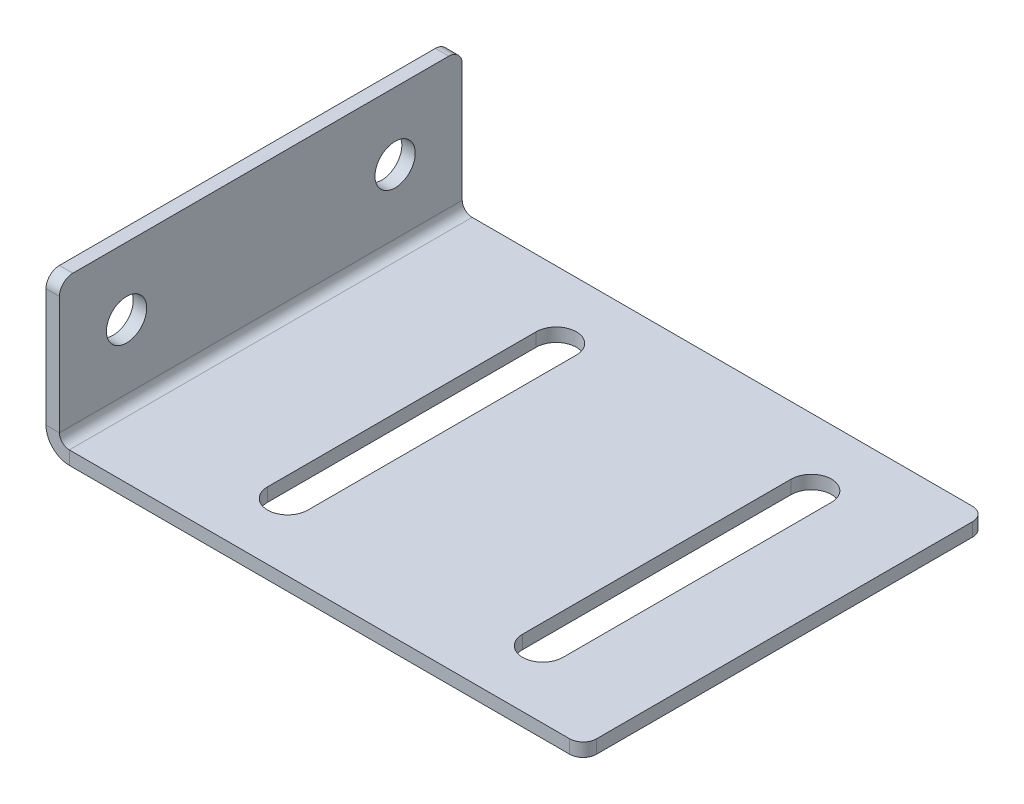
ISO-10303-21;
HEADER;
FILE_DESCRIPTION(('STEP AP214'),'2;1');
FILE_NAME('part.step','',(''),(''),'','','');
FILE_SCHEMA(('AUTOMOTIVE_DESIGN { 1 0 10303 214 1 1 1 1 }'));
ENDSEC;
DATA;
#1=APPLICATION_CONTEXT('core data for automotive mechanical design processes');
#2=APPLICATION_PROTOCOL_DEFINITION('international standard','automotive_design',2000,#1);
#3=PRODUCT_CONTEXT('',#1,'mechanical');
#4=PRODUCT('Part','Part','',(#3));
#5=PRODUCT_RELATED_PRODUCT_CATEGORY('part','',(#4));
#6=PRODUCT_DEFINITION_FORMATION('','',#4);
#7=PRODUCT_DEFINITION_CONTEXT('part definition',#1,'design');
#8=PRODUCT_DEFINITION('design','',#6,#7);
#9=PRODUCT_DEFINITION_SHAPE('','',#8);
#10=(LENGTH_UNIT() NAMED_UNIT(*) SI_UNIT(.MILLI.,.METRE.));
#11=(NAMED_UNIT(*) PLANE_ANGLE_UNIT() SI_UNIT($,.RADIAN.));
#12=(NAMED_UNIT(*) SI_UNIT($,.STERADIAN.) SOLID_ANGLE_UNIT());
#13=UNCERTAINTY_MEASURE_WITH_UNIT(LENGTH_MEASURE(1.E-05),#10,'distance_accuracy_value','');
#14=(GEOMETRIC_REPRESENTATION_CONTEXT(3) GLOBAL_UNCERTAINTY_ASSIGNED_CONTEXT((#13)) GLOBAL_UNIT_ASSIGNED_CONTEXT((#10,
#11,#12)) REPRESENTATION_CONTEXT('',''));
#15=CARTESIAN_POINT('',(0.,0.,0.));
#16=DIRECTION('',(0.,0.,1.));
#17=DIRECTION('',(1.,0.,0.));
#18=AXIS2_PLACEMENT_3D('',#15,#16,#17);
#19=CARTESIAN_POINT('',(-15.,9.53075326228543,15.));
#20=DIRECTION('',(0.,0.,1.));
#21=DIRECTION('',(0.,-1.,0.));
#22=AXIS2_PLACEMENT_3D('',#19,#20,#21);
#23=PLANE('',#22);
#24=DIRECTION('',(0.,-1.,0.));
#25=VECTOR('',#24,1.);
#26=CARTESIAN_POINT('',(-15.,9.53075326228543,15.));
#27=LINE('',#26,#25);
#28=CARTESIAN_POINT('',(-15.,9.53075326228543,15.));
#29=VERTEX_POINT('',#28);
#30=CARTESIAN_POINT('',(-15.,0.736600000000007,15.));
#31=VERTEX_POINT('',#30);
#32=EDGE_CURVE('E345',#29,#31,#27,.T.);
#33=ORIENTED_EDGE('',*,*,#32,.T.);
#34=DIRECTION('',(1.,0.,0.));
#35=VECTOR('',#34,1.);
#36=CARTESIAN_POINT('',(-15.,0.736600000000009,15.));
#37=LINE('',#36,#35);
#38=CARTESIAN_POINT('',(-14.,0.736600000000006,15.));
#39=VERTEX_POINT('',#38);
#40=EDGE_CURVE('E12',#31,#39,#37,.T.);
#41=ORIENTED_EDGE('',*,*,#40,.T.);
#42=DIRECTION('',(0.,-1.,0.));
#43=VECTOR('',#42,1.);
#44=CARTESIAN_POINT('',(-14.,9.53075326228543,15.));
#45=LINE('',#44,#43);
#46=CARTESIAN_POINT('',(-14.,9.53075326228543,15.));
#47=VERTEX_POINT('',#46);
#48=EDGE_CURVE('E55',#47,#39,#45,.T.);
#49=ORIENTED_EDGE('',*,*,#48,.F.);
#50=DIRECTION('',(1.,0.,0.));
#51=VECTOR('',#50,1.);
#52=CARTESIAN_POINT('',(-15.,9.53075326228543,15.));
#53=LINE('',#52,#51);
#54=EDGE_CURVE('E203',#29,#47,#53,.T.);
#55=ORIENTED_EDGE('',*,*,#54,.F.);
#56=EDGE_LOOP('',(#33,#41,#49,#55));
#57=FACE_BOUND('',#56,.T.);
#58=ADVANCED_FACE('F39',(#57),#23,.T.);
#59=CARTESIAN_POINT('',(-15.,9.53075326228544,-15.));
#60=DIRECTION('',(0.,0.,-1.));
#61=DIRECTION('',(0.,1.,0.));
#62=AXIS2_PLACEMENT_3D('',#59,#60,#61);
#63=PLANE('',#62);
#64=DIRECTION('',(0.,1.,0.));
#65=VECTOR('',#64,1.);
#66=CARTESIAN_POINT('',(-14.,9.53075326228543,-15.));
#67=LINE('',#66,#65);
#68=CARTESIAN_POINT('',(-14.,0.736600000000006,-15.));
#69=VERTEX_POINT('',#68);
#70=CARTESIAN_POINT('',(-14.,9.53075326228543,-15.));
#71=VERTEX_POINT('',#70);
#72=EDGE_CURVE('E62',#69,#71,#67,.T.);
#73=ORIENTED_EDGE('',*,*,#72,.F.);
#74=DIRECTION('',(-1.,0.,0.));
#75=VECTOR('',#74,1.);
#76=CARTESIAN_POINT('',(-15.,0.736600000000009,-15.));
#77=LINE('',#76,#75);
#78=CARTESIAN_POINT('',(-15.,0.736600000000002,-15.));
#79=VERTEX_POINT('',#78);
#80=EDGE_CURVE('E175',#69,#79,#77,.T.);
#81=ORIENTED_EDGE('',*,*,#80,.T.);
#82=DIRECTION('',(0.,1.,0.));
#83=VECTOR('',#82,1.);
#84=CARTESIAN_POINT('',(-15.,9.53075326228544,-15.));
#85=LINE('',#84,#83);
#86=CARTESIAN_POINT('',(-15.,9.53075326228544,-15.));
#87=VERTEX_POINT('',#86);
#88=EDGE_CURVE('E42',#79,#87,#85,.T.);
#89=ORIENTED_EDGE('',*,*,#88,.T.);
#90=DIRECTION('',(1.,0.,0.));
#91=VECTOR('',#90,1.);
#92=CARTESIAN_POINT('',(-15.,9.53075326228544,-15.));
#93=LINE('',#92,#91);
#94=EDGE_CURVE('E359',#87,#71,#93,.T.);
#95=ORIENTED_EDGE('',*,*,#94,.T.);
#96=EDGE_LOOP('',(#73,#81,#89,#95));
#97=FACE_BOUND('',#96,.T.);
#98=ADVANCED_FACE('F177',(#97),#63,.T.);
#99=CARTESIAN_POINT('',(-14.0000000000001,-38.4692467377146,14.));
#100=DIRECTION('',(1.,0.,0.));
#101=DIRECTION('',(0.,0.,1.));
#102=AXIS2_PLACEMENT_3D('',#99,#100,#101);
#103=PLANE('',#102);
#104=CARTESIAN_POINT('',(-14.,5.53075326228543,10.));
#105=DIRECTION('',(1.,0.,0.));
#106=DIRECTION('',(0.,0.,1.));
#107=AXIS2_PLACEMENT_3D('',#104,#105,#106);
#108=CIRCLE('',#107,1.5);
#109=CARTESIAN_POINT('',(-14.,5.53075326228543,11.5));
#110=VERTEX_POINT('',#109);
#111=EDGE_CURVE('E330',#110,#110,#108,.T.);
#112=ORIENTED_EDGE('',*,*,#111,.F.);
#113=EDGE_LOOP('',(#112));
#114=FACE_BOUND('',#113,.T.);
#115=CARTESIAN_POINT('',(-14.,5.53075326228543,-10.));
#116=DIRECTION('',(1.,0.,0.));
#117=DIRECTION('',(0.,0.,1.));
#118=AXIS2_PLACEMENT_3D('',#115,#116,#117);
#119=CIRCLE('',#118,1.5);
#120=CARTESIAN_POINT('',(-14.,5.53075326228543,-8.49999999999999));
#121=VERTEX_POINT('',#120);
#122=EDGE_CURVE('E224',#121,#121,#119,.T.);
#123=ORIENTED_EDGE('',*,*,#122,.F.);
#124=EDGE_LOOP('',(#123));
#125=FACE_BOUND('',#124,.T.);
#126=ORIENTED_EDGE('',*,*,#48,.T.);
#127=DIRECTION('',(0.,0.,-1.));
#128=VECTOR('',#127,1.);
#129=CARTESIAN_POINT('',(-14.,0.736600000000002,14.));
#130=LINE('',#129,#128);
#131=EDGE_CURVE('E47',#39,#69,#130,.T.);
#132=ORIENTED_EDGE('',*,*,#131,.T.);
#133=ORIENTED_EDGE('',*,*,#72,.T.);
#134=CARTESIAN_POINT('',(-14.,9.53075326228543,-14.));
#135=DIRECTION('',(1.,0.,0.));
#136=DIRECTION('',(0.,0.,1.));
#137=AXIS2_PLACEMENT_3D('',#134,#135,#136);
#138=CIRCLE('',#137,1.);
#139=CARTESIAN_POINT('',(-14.,10.5307532622854,-14.));
#140=VERTEX_POINT('',#139);
#141=EDGE_CURVE('E346',#71,#140,#138,.T.);
#142=ORIENTED_EDGE('',*,*,#141,.T.);
#143=DIRECTION('',(0.,0.,1.));
#144=VECTOR('',#143,1.);
#145=CARTESIAN_POINT('',(-14.,10.5307532622854,-14.));
#146=LINE('',#145,#144);
#147=CARTESIAN_POINT('',(-14.,10.5307532622854,14.));
#148=VERTEX_POINT('',#147);
#149=EDGE_CURVE('E349',#140,#148,#146,.T.);
#150=ORIENTED_EDGE('',*,*,#149,.T.);
#151=CARTESIAN_POINT('',(-14.,9.53075326228543,14.));
#152=DIRECTION('',(1.,0.,0.));
#153=DIRECTION('',(0.,0.,1.));
#154=AXIS2_PLACEMENT_3D('',#151,#152,#153);
#155=CIRCLE('',#154,0.999999999999999);
#156=EDGE_CURVE('E352',#148,#47,#155,.T.);
#157=ORIENTED_EDGE('',*,*,#156,.T.);
#158=EDGE_LOOP('',(#126,#132,#133,#142,#150,#157));
#159=FACE_BOUND('',#158,.T.);
#160=ADVANCED_FACE('F363',(#114,#125,#159),#103,.T.);
#161=CARTESIAN_POINT('',(-15.,9.53075326228543,14.));
#162=DIRECTION('',(1.,0.,0.));
#163=DIRECTION('',(0.,0.,1.));
#164=AXIS2_PLACEMENT_3D('',#161,#162,#163);
#165=CYLINDRICAL_SURFACE('',#164,0.999999999999999);
#166=ORIENTED_EDGE('',*,*,#156,.F.);
#167=DIRECTION('',(1.,0.,0.));
#168=VECTOR('',#167,1.);
#169=CARTESIAN_POINT('',(-15.,10.5307532622854,14.));
#170=LINE('',#169,#168);
#171=CARTESIAN_POINT('',(-15.,10.5307532622854,14.));
#172=VERTEX_POINT('',#171);
#173=EDGE_CURVE('E355',#172,#148,#170,.T.);
#174=ORIENTED_EDGE('',*,*,#173,.F.);
#175=CARTESIAN_POINT('',(-15.,9.53075326228543,14.));
#176=DIRECTION('',(1.,0.,0.));
#177=DIRECTION('',(0.,0.,1.));
#178=AXIS2_PLACEMENT_3D('',#175,#176,#177);
#179=CIRCLE('',#178,0.999999999999999);
#180=EDGE_CURVE('E342',#172,#29,#179,.T.);
#181=ORIENTED_EDGE('',*,*,#180,.T.);
#182=ORIENTED_EDGE('',*,*,#54,.T.);
#183=EDGE_LOOP('',(#166,#174,#181,#182));
#184=FACE_BOUND('',#183,.T.);
#185=ADVANCED_FACE('F425',(#184),#165,.T.);
#186=CARTESIAN_POINT('',(-15.,10.5307532622854,-14.));
#187=DIRECTION('',(0.,1.,0.));
#188=DIRECTION('',(0.,0.,1.));
#189=AXIS2_PLACEMENT_3D('',#186,#187,#188);
#190=PLANE('',#189);
#191=ORIENTED_EDGE('',*,*,#149,.F.);
#192=DIRECTION('',(1.,0.,0.));
#193=VECTOR('',#192,1.);
#194=CARTESIAN_POINT('',(-15.,10.5307532622854,-14.));
#195=LINE('',#194,#193);
#196=CARTESIAN_POINT('',(-15.,10.5307532622854,-14.));
#197=VERTEX_POINT('',#196);
#198=EDGE_CURVE('E357',#197,#140,#195,.T.);
#199=ORIENTED_EDGE('',*,*,#198,.F.);
#200=DIRECTION('',(0.,0.,1.));
#201=VECTOR('',#200,1.);
#202=CARTESIAN_POINT('',(-15.,10.5307532622854,-14.));
#203=LINE('',#202,#201);
#204=EDGE_CURVE('E339',#197,#172,#203,.T.);
#205=ORIENTED_EDGE('',*,*,#204,.T.);
#206=ORIENTED_EDGE('',*,*,#173,.T.);
#207=EDGE_LOOP('',(#191,#199,#205,#206));
#208=FACE_BOUND('',#207,.T.);
#209=ADVANCED_FACE('F370',(#208),#190,.T.);
#210=CARTESIAN_POINT('',(-15.,9.53075326228544,-14.));
#211=DIRECTION('',(1.,0.,0.));
#212=DIRECTION('',(0.,0.,1.));
#213=AXIS2_PLACEMENT_3D('',#210,#211,#212);
#214=CYLINDRICAL_SURFACE('',#213,1.);
#215=ORIENTED_EDGE('',*,*,#141,.F.);
#216=ORIENTED_EDGE('',*,*,#94,.F.);
#217=CARTESIAN_POINT('',(-15.,9.53075326228544,-14.));
#218=DIRECTION('',(1.,0.,0.));
#219=DIRECTION('',(0.,0.,1.));
#220=AXIS2_PLACEMENT_3D('',#217,#218,#219);
#221=CIRCLE('',#220,1.);
#222=EDGE_CURVE('E194',#87,#197,#221,.T.);
#223=ORIENTED_EDGE('',*,*,#222,.T.);
#224=ORIENTED_EDGE('',*,*,#198,.T.);
#225=EDGE_LOOP('',(#215,#216,#223,#224));
#226=FACE_BOUND('',#225,.T.);
#227=ADVANCED_FACE('F367',(#226),#214,.T.);
#228=CARTESIAN_POINT('',(-15.0000000000001,-38.4692467377146,14.));
#229=DIRECTION('',(1.,0.,0.));
#230=DIRECTION('',(0.,0.,1.));
#231=AXIS2_PLACEMENT_3D('',#228,#229,#230);
#232=PLANE('',#231);
#233=DIRECTION('',(0.,0.,-1.));
#234=VECTOR('',#233,1.);
#235=CARTESIAN_POINT('',(-15.,0.736600000000006,14.));
#236=LINE('',#235,#234);
#237=EDGE_CURVE('E183',#31,#79,#236,.T.);
#238=ORIENTED_EDGE('',*,*,#237,.F.);
#239=ORIENTED_EDGE('',*,*,#32,.F.);
#240=ORIENTED_EDGE('',*,*,#180,.F.);
#241=ORIENTED_EDGE('',*,*,#204,.F.);
#242=ORIENTED_EDGE('',*,*,#222,.F.);
#243=ORIENTED_EDGE('',*,*,#88,.F.);
#244=EDGE_LOOP('',(#238,#239,#240,#241,#242,#243));
#245=FACE_BOUND('',#244,.T.);
#246=CARTESIAN_POINT('',(-15.,5.53075326228543,-10.));
#247=DIRECTION('',(1.,0.,0.));
#248=DIRECTION('',(0.,0.,1.));
#249=AXIS2_PLACEMENT_3D('',#246,#247,#248);
#250=CIRCLE('',#249,1.5);
#251=CARTESIAN_POINT('',(-15.,5.53075326228543,-8.49999999999999));
#252=VERTEX_POINT('',#251);
#253=EDGE_CURVE('E327',#252,#252,#250,.T.);
#254=ORIENTED_EDGE('',*,*,#253,.T.);
#255=EDGE_LOOP('',(#254));
#256=FACE_BOUND('',#255,.T.);
#257=CARTESIAN_POINT('',(-15.,5.53075326228543,10.));
#258=DIRECTION('',(1.,0.,0.));
#259=DIRECTION('',(0.,0.,1.));
#260=AXIS2_PLACEMENT_3D('',#257,#258,#259);
#261=CIRCLE('',#260,1.5);
#262=CARTESIAN_POINT('',(-15.,5.53075326228543,11.5));
#263=VERTEX_POINT('',#262);
#264=EDGE_CURVE('E333',#263,#263,#261,.T.);
#265=ORIENTED_EDGE('',*,*,#264,.T.);
#266=EDGE_LOOP('',(#265));
#267=FACE_BOUND('',#266,.T.);
#268=ADVANCED_FACE('F188',(#245,#256,#267),#232,.F.);
#269=CARTESIAN_POINT('',(-15.,5.53075326228543,10.));
#270=DIRECTION('',(1.,0.,0.));
#271=DIRECTION('',(0.,0.,1.));
#272=AXIS2_PLACEMENT_3D('',#269,#270,#271);
#273=CYLINDRICAL_SURFACE('',#272,1.5);
#274=ORIENTED_EDGE('',*,*,#264,.F.);
#275=EDGE_LOOP('',(#274));
#276=FACE_BOUND('',#275,.T.);
#277=ORIENTED_EDGE('',*,*,#111,.T.);
#278=EDGE_LOOP('',(#277));
#279=FACE_BOUND('',#278,.T.);
#280=ADVANCED_FACE('F430',(#276,#279),#273,.F.);
#281=CARTESIAN_POINT('',(-15.,5.53075326228543,-10.));
#282=DIRECTION('',(1.,0.,0.));
#283=DIRECTION('',(0.,0.,1.));
#284=AXIS2_PLACEMENT_3D('',#281,#282,#283);
#285=CYLINDRICAL_SURFACE('',#284,1.5);
#286=ORIENTED_EDGE('',*,*,#253,.F.);
#287=EDGE_LOOP('',(#286));
#288=FACE_BOUND('',#287,.T.);
#289=ORIENTED_EDGE('',*,*,#122,.T.);
#290=EDGE_LOOP('',(#289));
#291=FACE_BOUND('',#290,.T.);
#292=ADVANCED_FACE('F439',(#288,#291),#285,.F.);
#293=CARTESIAN_POINT('',(24.,-1.,14.));
#294=DIRECTION('',(0.,1.,0.));
#295=DIRECTION('',(0.,0.,1.));
#296=AXIS2_PLACEMENT_3D('',#293,#294,#295);
#297=CYLINDRICAL_SURFACE('',#296,1.);
#298=CARTESIAN_POINT('',(24.,0.,14.));
#299=DIRECTION('',(0.,1.,0.));
#300=DIRECTION('',(0.,0.,1.));
#301=AXIS2_PLACEMENT_3D('',#298,#299,#300);
#302=CIRCLE('',#301,1.);
#303=CARTESIAN_POINT('',(24.,0.,15.));
#304=VERTEX_POINT('',#303);
#305=CARTESIAN_POINT('',(25.,0.,14.));
#306=VERTEX_POINT('',#305);
#307=EDGE_CURVE('E235',#304,#306,#302,.T.);
#308=ORIENTED_EDGE('',*,*,#307,.F.);
#309=DIRECTION('',(0.,1.,0.));
#310=VECTOR('',#309,1.);
#311=CARTESIAN_POINT('',(24.,-1.,15.));
#312=LINE('',#311,#310);
#313=CARTESIAN_POINT('',(24.,-1.,15.));
#314=VERTEX_POINT('',#313);
#315=EDGE_CURVE('E221',#314,#304,#312,.T.);
#316=ORIENTED_EDGE('',*,*,#315,.F.);
#317=CARTESIAN_POINT('',(24.,-1.,14.));
#318=DIRECTION('',(0.,1.,0.));
#319=DIRECTION('',(0.,0.,1.));
#320=AXIS2_PLACEMENT_3D('',#317,#318,#319);
#321=CIRCLE('',#320,1.);
#322=CARTESIAN_POINT('',(25.,-1.,14.));
#323=VERTEX_POINT('',#322);
#324=EDGE_CURVE('E321',#314,#323,#321,.T.);
#325=ORIENTED_EDGE('',*,*,#324,.T.);
#326=DIRECTION('',(0.,1.,0.));
#327=VECTOR('',#326,1.);
#328=CARTESIAN_POINT('',(25.,-1.,14.));
#329=LINE('',#328,#327);
#330=EDGE_CURVE('E319',#323,#306,#329,.T.);
#331=ORIENTED_EDGE('',*,*,#330,.T.);
#332=EDGE_LOOP('',(#308,#316,#325,#331));
#333=FACE_BOUND('',#332,.T.);
#334=ADVANCED_FACE('F400',(#333),#297,.T.);
#335=CARTESIAN_POINT('',(25.,-1.,-14.));
#336=DIRECTION('',(1.,0.,0.));
#337=DIRECTION('',(0.,0.,-1.));
#338=AXIS2_PLACEMENT_3D('',#335,#336,#337);
#339=PLANE('',#338);
#340=DIRECTION('',(0.,0.,-1.));
#341=VECTOR('',#340,1.);
#342=CARTESIAN_POINT('',(25.,0.,-14.));
#343=LINE('',#342,#341);
#344=CARTESIAN_POINT('',(25.,0.,-14.));
#345=VERTEX_POINT('',#344);
#346=EDGE_CURVE('E232',#306,#345,#343,.T.);
#347=ORIENTED_EDGE('',*,*,#346,.F.);
#348=ORIENTED_EDGE('',*,*,#330,.F.);
#349=DIRECTION('',(0.,0.,-1.));
#350=VECTOR('',#349,1.);
#351=CARTESIAN_POINT('',(25.,-1.,-14.));
#352=LINE('',#351,#350);
#353=CARTESIAN_POINT('',(25.,-1.,-14.));
#354=VERTEX_POINT('',#353);
#355=EDGE_CURVE('E316',#323,#354,#352,.T.);
#356=ORIENTED_EDGE('',*,*,#355,.T.);
#357=DIRECTION('',(0.,1.,0.));
#358=VECTOR('',#357,1.);
#359=CARTESIAN_POINT('',(25.,-1.,-14.));
#360=LINE('',#359,#358);
#361=EDGE_CURVE('E314',#354,#345,#360,.T.);
#362=ORIENTED_EDGE('',*,*,#361,.T.);
#363=EDGE_LOOP('',(#347,#348,#356,#362));
#364=FACE_BOUND('',#363,.T.);
#365=ADVANCED_FACE('F403',(#364),#339,.T.);
#366=CARTESIAN_POINT('',(24.,-1.,-14.));
#367=DIRECTION('',(0.,1.,0.));
#368=DIRECTION('',(0.,0.,1.));
#369=AXIS2_PLACEMENT_3D('',#366,#367,#368);
#370=CYLINDRICAL_SURFACE('',#369,1.);
#371=CARTESIAN_POINT('',(24.,0.,-14.));
#372=DIRECTION('',(0.,1.,0.));
#373=DIRECTION('',(0.,0.,-1.));
#374=AXIS2_PLACEMENT_3D('',#371,#372,#373);
#375=CIRCLE('',#374,1.);
#376=CARTESIAN_POINT('',(24.,0.,-15.));
#377=VERTEX_POINT('',#376);
#378=EDGE_CURVE('E229',#345,#377,#375,.T.);
#379=ORIENTED_EDGE('',*,*,#378,.F.);
#380=ORIENTED_EDGE('',*,*,#361,.F.);
#381=CARTESIAN_POINT('',(24.,-1.,-14.));
#382=DIRECTION('',(0.,1.,0.));
#383=DIRECTION('',(0.,0.,-1.));
#384=AXIS2_PLACEMENT_3D('',#381,#382,#383);
#385=CIRCLE('',#384,1.);
#386=CARTESIAN_POINT('',(24.,-1.,-15.));
#387=VERTEX_POINT('',#386);
#388=EDGE_CURVE('E311',#354,#387,#385,.T.);
#389=ORIENTED_EDGE('',*,*,#388,.T.);
#390=DIRECTION('',(0.,1.,0.));
#391=VECTOR('',#390,1.);
#392=CARTESIAN_POINT('',(24.,-1.,-15.));
#393=LINE('',#392,#391);
#394=EDGE_CURVE('E309',#387,#377,#393,.T.);
#395=ORIENTED_EDGE('',*,*,#394,.T.);
#396=EDGE_LOOP('',(#379,#380,#389,#395));
#397=FACE_BOUND('',#396,.T.);
#398=ADVANCED_FACE('F405',(#397),#370,.T.);
#399=CARTESIAN_POINT('',(17.,-1.,-9.99999999999999));
#400=DIRECTION('',(0.,1.,0.));
#401=DIRECTION('',(0.,0.,1.));
#402=AXIS2_PLACEMENT_3D('',#399,#400,#401);
#403=CYLINDRICAL_SURFACE('',#402,1.5);
#404=CARTESIAN_POINT('',(17.,0.,-9.99999999999999));
#405=DIRECTION('',(0.,1.,0.));
#406=DIRECTION('',(0.,0.,1.));
#407=AXIS2_PLACEMENT_3D('',#404,#405,#406);
#408=CIRCLE('',#407,1.5);
#409=CARTESIAN_POINT('',(18.5,0.,-9.99999999999999));
#410=VERTEX_POINT('',#409);
#411=CARTESIAN_POINT('',(15.5,0.,-9.99999999999999));
#412=VERTEX_POINT('',#411);
#413=EDGE_CURVE('E306',#410,#412,#408,.T.);
#414=ORIENTED_EDGE('',*,*,#413,.T.);
#415=DIRECTION('',(0.,1.,0.));
#416=VECTOR('',#415,1.);
#417=CARTESIAN_POINT('',(15.5,-1.,-9.99999999999999));
#418=LINE('',#417,#416);
#419=CARTESIAN_POINT('',(15.5,-1.,-9.99999999999999));
#420=VERTEX_POINT('',#419);
#421=EDGE_CURVE('E289',#420,#412,#418,.T.);
#422=ORIENTED_EDGE('',*,*,#421,.F.);
#423=CARTESIAN_POINT('',(17.,-1.,-9.99999999999999));
#424=DIRECTION('',(0.,1.,0.));
#425=DIRECTION('',(0.,0.,1.));
#426=AXIS2_PLACEMENT_3D('',#423,#424,#425);
#427=CIRCLE('',#426,1.5);
#428=CARTESIAN_POINT('',(18.5,-1.,-9.99999999999999));
#429=VERTEX_POINT('',#428);
#430=EDGE_CURVE('E245',#429,#420,#427,.T.);
#431=ORIENTED_EDGE('',*,*,#430,.F.);
#432=DIRECTION('',(0.,1.,0.));
#433=VECTOR('',#432,1.);
#434=CARTESIAN_POINT('',(18.5,-1.,-9.99999999999999));
#435=LINE('',#434,#433);
#436=EDGE_CURVE('E304',#429,#410,#435,.T.);
#437=ORIENTED_EDGE('',*,*,#436,.T.);
#438=EDGE_LOOP('',(#414,#422,#431,#437));
#439=FACE_BOUND('',#438,.T.);
#440=ADVANCED_FACE('F407',(#439),#403,.F.);
#441=CARTESIAN_POINT('',(18.5,-1.,10.));
#442=DIRECTION('',(1.,0.,0.));
#443=DIRECTION('',(0.,0.,-1.));
#444=AXIS2_PLACEMENT_3D('',#441,#442,#443);
#445=PLANE('',#444);
#446=DIRECTION('',(0.,0.,-1.));
#447=VECTOR('',#446,1.);
#448=CARTESIAN_POINT('',(18.5,0.,10.));
#449=LINE('',#448,#447);
#450=CARTESIAN_POINT('',(18.5,0.,10.));
#451=VERTEX_POINT('',#450);
#452=EDGE_CURVE('E301',#451,#410,#449,.T.);
#453=ORIENTED_EDGE('',*,*,#452,.T.);
#454=ORIENTED_EDGE('',*,*,#436,.F.);
#455=DIRECTION('',(0.,0.,-1.));
#456=VECTOR('',#455,1.);
#457=CARTESIAN_POINT('',(18.5,-1.,10.));
#458=LINE('',#457,#456);
#459=CARTESIAN_POINT('',(18.5,-1.,10.));
#460=VERTEX_POINT('',#459);
#461=EDGE_CURVE('E248',#460,#429,#458,.T.);
#462=ORIENTED_EDGE('',*,*,#461,.F.);
#463=DIRECTION('',(0.,1.,0.));
#464=VECTOR('',#463,1.);
#465=CARTESIAN_POINT('',(18.5,-1.,10.));
#466=LINE('',#465,#464);
#467=EDGE_CURVE('E298',#460,#451,#466,.T.);
#468=ORIENTED_EDGE('',*,*,#467,.T.);
#469=EDGE_LOOP('',(#453,#454,#462,#468));
#470=FACE_BOUND('',#469,.T.);
#471=ADVANCED_FACE('F413',(#470),#445,.F.);
#472=CARTESIAN_POINT('',(17.,-1.,10.));
#473=DIRECTION('',(0.,1.,0.));
#474=DIRECTION('',(0.,0.,1.));
#475=AXIS2_PLACEMENT_3D('',#472,#473,#474);
#476=CYLINDRICAL_SURFACE('',#475,1.5);
#477=CARTESIAN_POINT('',(17.,0.,10.));
#478=DIRECTION('',(0.,1.,0.));
#479=DIRECTION('',(0.,0.,1.));
#480=AXIS2_PLACEMENT_3D('',#477,#478,#479);
#481=CIRCLE('',#480,1.5);
#482=CARTESIAN_POINT('',(15.5,0.,10.));
#483=VERTEX_POINT('',#482);
#484=EDGE_CURVE('E296',#483,#451,#481,.T.);
#485=ORIENTED_EDGE('',*,*,#484,.T.);
#486=ORIENTED_EDGE('',*,*,#467,.F.);
#487=CARTESIAN_POINT('',(17.,-1.,10.));
#488=DIRECTION('',(0.,1.,0.));
#489=DIRECTION('',(0.,0.,1.));
#490=AXIS2_PLACEMENT_3D('',#487,#488,#489);
#491=CIRCLE('',#490,1.5);
#492=CARTESIAN_POINT('',(15.5,-1.,10.));
#493=VERTEX_POINT('',#492);
#494=EDGE_CURVE('E251',#493,#460,#491,.T.);
#495=ORIENTED_EDGE('',*,*,#494,.F.);
#496=DIRECTION('',(0.,1.,0.));
#497=VECTOR('',#496,1.);
#498=CARTESIAN_POINT('',(15.5,-1.,10.));
#499=LINE('',#498,#497);
#500=EDGE_CURVE('E294',#493,#483,#499,.T.);
#501=ORIENTED_EDGE('',*,*,#500,.T.);
#502=EDGE_LOOP('',(#485,#486,#495,#501));
#503=FACE_BOUND('',#502,.T.);
#504=ADVANCED_FACE('F472',(#503),#476,.F.);
#505=CARTESIAN_POINT('',(15.5,-1.,10.));
#506=DIRECTION('',(-1.,0.,0.));
#507=DIRECTION('',(0.,0.,1.));
#508=AXIS2_PLACEMENT_3D('',#505,#506,#507);
#509=PLANE('',#508);
#510=DIRECTION('',(0.,0.,1.));
#511=VECTOR('',#510,1.);
#512=CARTESIAN_POINT('',(15.5,0.,10.));
#513=LINE('',#512,#511);
#514=EDGE_CURVE('E291',#412,#483,#513,.T.);
#515=ORIENTED_EDGE('',*,*,#514,.T.);
#516=ORIENTED_EDGE('',*,*,#500,.F.);
#517=DIRECTION('',(0.,0.,1.));
#518=VECTOR('',#517,1.);
#519=CARTESIAN_POINT('',(15.5,-1.,10.));
#520=LINE('',#519,#518);
#521=EDGE_CURVE('E254',#420,#493,#520,.T.);
#522=ORIENTED_EDGE('',*,*,#521,.F.);
#523=ORIENTED_EDGE('',*,*,#421,.T.);
#524=EDGE_LOOP('',(#515,#516,#522,#523));
#525=FACE_BOUND('',#524,.T.);
#526=ADVANCED_FACE('F468',(#525),#509,.F.);
#527=CARTESIAN_POINT('',(-1.99999999999999,-1.,-9.99999999999999));
#528=DIRECTION('',(0.,1.,0.));
#529=DIRECTION('',(0.,0.,1.));
#530=AXIS2_PLACEMENT_3D('',#527,#528,#529);
#531=CYLINDRICAL_SURFACE('',#530,1.5);
#532=CARTESIAN_POINT('',(-1.99999999999999,0.,-9.99999999999999));
#533=DIRECTION('',(0.,1.,0.));
#534=DIRECTION('',(0.,0.,1.));
#535=AXIS2_PLACEMENT_3D('',#532,#533,#534);
#536=CIRCLE('',#535,1.5);
#537=CARTESIAN_POINT('',(-0.499999999999988,0.,-9.99999999999999));
#538=VERTEX_POINT('',#537);
#539=CARTESIAN_POINT('',(-3.49999999999999,0.,-9.99999999999999));
#540=VERTEX_POINT('',#539);
#541=EDGE_CURVE('E286',#538,#540,#536,.T.);
#542=ORIENTED_EDGE('',*,*,#541,.T.);
#543=DIRECTION('',(0.,1.,0.));
#544=VECTOR('',#543,1.);
#545=CARTESIAN_POINT('',(-3.49999999999999,-1.,-9.99999999999999));
#546=LINE('',#545,#544);
#547=CARTESIAN_POINT('',(-3.49999999999999,-1.,-9.99999999999999));
#548=VERTEX_POINT('',#547);
#549=EDGE_CURVE('E269',#548,#540,#546,.T.);
#550=ORIENTED_EDGE('',*,*,#549,.F.);
#551=CARTESIAN_POINT('',(-1.99999999999999,-1.,-9.99999999999999));
#552=DIRECTION('',(0.,1.,0.));
#553=DIRECTION('',(0.,0.,1.));
#554=AXIS2_PLACEMENT_3D('',#551,#552,#553);
#555=CIRCLE('',#554,1.5);
#556=CARTESIAN_POINT('',(-0.499999999999987,-1.,-9.99999999999999));
#557=VERTEX_POINT('',#556);
#558=EDGE_CURVE('E257',#557,#548,#555,.T.);
#559=ORIENTED_EDGE('',*,*,#558,.F.);
#560=DIRECTION('',(0.,1.,0.));
#561=VECTOR('',#560,1.);
#562=CARTESIAN_POINT('',(-0.499999999999988,-1.,-9.99999999999999));
#563=LINE('',#562,#561);
#564=EDGE_CURVE('E284',#557,#538,#563,.T.);
#565=ORIENTED_EDGE('',*,*,#564,.T.);
#566=EDGE_LOOP('',(#542,#550,#559,#565));
#567=FACE_BOUND('',#566,.T.);
#568=ADVANCED_FACE('F464',(#567),#531,.F.);
#569=CARTESIAN_POINT('',(-0.499999999999988,-1.,10.));
#570=DIRECTION('',(1.,0.,0.));
#571=DIRECTION('',(0.,0.,-1.));
#572=AXIS2_PLACEMENT_3D('',#569,#570,#571);
#573=PLANE('',#572);
#574=DIRECTION('',(0.,0.,-1.));
#575=VECTOR('',#574,1.);
#576=CARTESIAN_POINT('',(-0.499999999999988,0.,10.));
#577=LINE('',#576,#575);
#578=CARTESIAN_POINT('',(-0.499999999999987,0.,10.));
#579=VERTEX_POINT('',#578);
#580=EDGE_CURVE('E281',#579,#538,#577,.T.);
#581=ORIENTED_EDGE('',*,*,#580,.T.);
#582=ORIENTED_EDGE('',*,*,#564,.F.);
#583=DIRECTION('',(0.,0.,-1.));
#584=VECTOR('',#583,1.);
#585=CARTESIAN_POINT('',(-0.499999999999988,-1.,10.));
#586=LINE('',#585,#584);
#587=CARTESIAN_POINT('',(-0.499999999999988,-1.,10.));
#588=VERTEX_POINT('',#587);
#589=EDGE_CURVE('E260',#588,#557,#586,.T.);
#590=ORIENTED_EDGE('',*,*,#589,.F.);
#591=DIRECTION('',(0.,1.,0.));
#592=VECTOR('',#591,1.);
#593=CARTESIAN_POINT('',(-0.499999999999988,-1.,10.));
#594=LINE('',#593,#592);
#595=EDGE_CURVE('E278',#588,#579,#594,.T.);
#596=ORIENTED_EDGE('',*,*,#595,.T.);
#597=EDGE_LOOP('',(#581,#582,#590,#596));
#598=FACE_BOUND('',#597,.T.);
#599=ADVANCED_FACE('F460',(#598),#573,.F.);
#600=CARTESIAN_POINT('',(-1.99999999999999,-1.,10.));
#601=DIRECTION('',(0.,1.,0.));
#602=DIRECTION('',(0.,0.,1.));
#603=AXIS2_PLACEMENT_3D('',#600,#601,#602);
#604=CYLINDRICAL_SURFACE('',#603,1.5);
#605=CARTESIAN_POINT('',(-1.99999999999999,0.,10.));
#606=DIRECTION('',(0.,1.,0.));
#607=DIRECTION('',(0.,0.,1.));
#608=AXIS2_PLACEMENT_3D('',#605,#606,#607);
#609=CIRCLE('',#608,1.5);
#610=CARTESIAN_POINT('',(-3.49999999999999,0.,10.));
#611=VERTEX_POINT('',#610);
#612=EDGE_CURVE('E276',#611,#579,#609,.T.);
#613=ORIENTED_EDGE('',*,*,#612,.T.);
#614=ORIENTED_EDGE('',*,*,#595,.F.);
#615=CARTESIAN_POINT('',(-1.99999999999999,-1.,10.));
#616=DIRECTION('',(0.,1.,0.));
#617=DIRECTION('',(0.,0.,1.));
#618=AXIS2_PLACEMENT_3D('',#615,#616,#617);
#619=CIRCLE('',#618,1.5);
#620=CARTESIAN_POINT('',(-3.49999999999999,-1.,10.));
#621=VERTEX_POINT('',#620);
#622=EDGE_CURVE('E263',#621,#588,#619,.T.);
#623=ORIENTED_EDGE('',*,*,#622,.F.);
#624=DIRECTION('',(0.,1.,0.));
#625=VECTOR('',#624,1.);
#626=CARTESIAN_POINT('',(-3.49999999999999,-1.,10.));
#627=LINE('',#626,#625);
#628=EDGE_CURVE('E274',#621,#611,#627,.T.);
#629=ORIENTED_EDGE('',*,*,#628,.T.);
#630=EDGE_LOOP('',(#613,#614,#623,#629));
#631=FACE_BOUND('',#630,.T.);
#632=ADVANCED_FACE('F456',(#631),#604,.F.);
#633=CARTESIAN_POINT('',(-3.49999999999999,-1.,10.));
#634=DIRECTION('',(-1.,0.,0.));
#635=DIRECTION('',(0.,0.,1.));
#636=AXIS2_PLACEMENT_3D('',#633,#634,#635);
#637=PLANE('',#636);
#638=DIRECTION('',(0.,0.,1.));
#639=VECTOR('',#638,1.);
#640=CARTESIAN_POINT('',(-3.49999999999999,0.,10.));
#641=LINE('',#640,#639);
#642=EDGE_CURVE('E271',#540,#611,#641,.T.);
#643=ORIENTED_EDGE('',*,*,#642,.T.);
#644=ORIENTED_EDGE('',*,*,#628,.F.);
#645=DIRECTION('',(0.,0.,1.));
#646=VECTOR('',#645,1.);
#647=CARTESIAN_POINT('',(-3.49999999999999,-1.,10.));
#648=LINE('',#647,#646);
#649=EDGE_CURVE('E266',#548,#621,#648,.T.);
#650=ORIENTED_EDGE('',*,*,#649,.F.);
#651=ORIENTED_EDGE('',*,*,#549,.T.);
#652=EDGE_LOOP('',(#643,#644,#650,#651));
#653=FACE_BOUND('',#652,.T.);
#654=ADVANCED_FACE('F452',(#653),#637,.F.);
#655=CARTESIAN_POINT('',(24.,-1.,14.));
#656=DIRECTION('',(0.,1.,0.));
#657=DIRECTION('',(0.,0.,1.));
#658=AXIS2_PLACEMENT_3D('',#655,#656,#657);
#659=PLANE('',#658);
#660=ORIENTED_EDGE('',*,*,#649,.T.);
#661=ORIENTED_EDGE('',*,*,#622,.T.);
#662=ORIENTED_EDGE('',*,*,#589,.T.);
#663=ORIENTED_EDGE('',*,*,#558,.T.);
#664=EDGE_LOOP('',(#660,#661,#662,#663));
#665=FACE_BOUND('',#664,.T.);
#666=ORIENTED_EDGE('',*,*,#521,.T.);
#667=ORIENTED_EDGE('',*,*,#494,.T.);
#668=ORIENTED_EDGE('',*,*,#461,.T.);
#669=ORIENTED_EDGE('',*,*,#430,.T.);
#670=EDGE_LOOP('',(#666,#667,#668,#669));
#671=FACE_BOUND('',#670,.T.);
#672=DIRECTION('',(1.,0.,0.));
#673=VECTOR('',#672,1.);
#674=CARTESIAN_POINT('',(-24.,-1.,15.));
#675=LINE('',#674,#673);
#676=CARTESIAN_POINT('',(-13.2634,-1.,15.));
#677=VERTEX_POINT('',#676);
#678=EDGE_CURVE('E225',#677,#314,#675,.T.);
#679=ORIENTED_EDGE('',*,*,#678,.F.);
#680=DIRECTION('',(0.,0.,-1.));
#681=VECTOR('',#680,1.);
#682=CARTESIAN_POINT('',(-13.2634,-1.,14.));
#683=LINE('',#682,#681);
#684=CARTESIAN_POINT('',(-13.2634,-1.,-15.));
#685=VERTEX_POINT('',#684);
#686=EDGE_CURVE('E242',#677,#685,#683,.T.);
#687=ORIENTED_EDGE('',*,*,#686,.T.);
#688=DIRECTION('',(-1.,0.,0.));
#689=VECTOR('',#688,1.);
#690=CARTESIAN_POINT('',(-24.,-1.,-15.));
#691=LINE('',#690,#689);
#692=EDGE_CURVE('E240',#387,#685,#691,.T.);
#693=ORIENTED_EDGE('',*,*,#692,.F.);
#694=ORIENTED_EDGE('',*,*,#388,.F.);
#695=ORIENTED_EDGE('',*,*,#355,.F.);
#696=ORIENTED_EDGE('',*,*,#324,.F.);
#697=EDGE_LOOP('',(#679,#687,#693,#694,#695,#696));
#698=FACE_BOUND('',#697,.T.);
#699=ADVANCED_FACE('F396',(#665,#671,#698),#659,.F.);
#700=CARTESIAN_POINT('',(-24.,-1.,-15.));
#701=DIRECTION('',(0.,0.,-1.));
#702=DIRECTION('',(-1.,0.,0.));
#703=AXIS2_PLACEMENT_3D('',#700,#701,#702);
#704=PLANE('',#703);
#705=DIRECTION('',(0.,-1.,0.));
#706=VECTOR('',#705,1.);
#707=CARTESIAN_POINT('',(-13.2634,-1.,-15.));
#708=LINE('',#707,#706);
#709=CARTESIAN_POINT('',(-13.2634,0.,-15.));
#710=VERTEX_POINT('',#709);
#711=EDGE_CURVE('E208',#710,#685,#708,.T.);
#712=ORIENTED_EDGE('',*,*,#711,.F.);
#713=DIRECTION('',(-1.,0.,0.));
#714=VECTOR('',#713,1.);
#715=CARTESIAN_POINT('',(-24.,0.,-15.));
#716=LINE('',#715,#714);
#717=EDGE_CURVE('E227',#377,#710,#716,.T.);
#718=ORIENTED_EDGE('',*,*,#717,.F.);
#719=ORIENTED_EDGE('',*,*,#394,.F.);
#720=ORIENTED_EDGE('',*,*,#692,.T.);
#721=EDGE_LOOP('',(#712,#718,#719,#720));
#722=FACE_BOUND('',#721,.T.);
#723=ADVANCED_FACE('F392',(#722),#704,.T.);
#724=CARTESIAN_POINT('',(24.,0.,14.));
#725=DIRECTION('',(0.,1.,0.));
#726=DIRECTION('',(0.,0.,1.));
#727=AXIS2_PLACEMENT_3D('',#724,#725,#726);
#728=PLANE('',#727);
#729=DIRECTION('',(0.,0.,-1.));
#730=VECTOR('',#729,1.);
#731=CARTESIAN_POINT('',(-13.2634,0.,14.));
#732=LINE('',#731,#730);
#733=CARTESIAN_POINT('',(-13.2634,0.,15.));
#734=VERTEX_POINT('',#733);
#735=EDGE_CURVE('E212',#734,#710,#732,.T.);
#736=ORIENTED_EDGE('',*,*,#735,.F.);
#737=DIRECTION('',(1.,0.,0.));
#738=VECTOR('',#737,1.);
#739=CARTESIAN_POINT('',(-24.,0.,15.));
#740=LINE('',#739,#738);
#741=EDGE_CURVE('E238',#734,#304,#740,.T.);
#742=ORIENTED_EDGE('',*,*,#741,.T.);
#743=ORIENTED_EDGE('',*,*,#307,.T.);
#744=ORIENTED_EDGE('',*,*,#346,.T.);
#745=ORIENTED_EDGE('',*,*,#378,.T.);
#746=ORIENTED_EDGE('',*,*,#717,.T.);
#747=EDGE_LOOP('',(#736,#742,#743,#744,#745,#746));
#748=FACE_BOUND('',#747,.T.);
#749=ORIENTED_EDGE('',*,*,#484,.F.);
#750=ORIENTED_EDGE('',*,*,#514,.F.);
#751=ORIENTED_EDGE('',*,*,#413,.F.);
#752=ORIENTED_EDGE('',*,*,#452,.F.);
#753=EDGE_LOOP('',(#749,#750,#751,#752));
#754=FACE_BOUND('',#753,.T.);
#755=ORIENTED_EDGE('',*,*,#612,.F.);
#756=ORIENTED_EDGE('',*,*,#642,.F.);
#757=ORIENTED_EDGE('',*,*,#541,.F.);
#758=ORIENTED_EDGE('',*,*,#580,.F.);
#759=EDGE_LOOP('',(#755,#756,#757,#758));
#760=FACE_BOUND('',#759,.T.);
#761=ADVANCED_FACE('F387',(#748,#754,#760),#728,.T.);
#762=CARTESIAN_POINT('',(-24.,-1.,15.));
#763=DIRECTION('',(0.,0.,1.));
#764=DIRECTION('',(1.,0.,0.));
#765=AXIS2_PLACEMENT_3D('',#762,#763,#764);
#766=PLANE('',#765);
#767=DIRECTION('',(0.,1.,0.));
#768=VECTOR('',#767,1.);
#769=CARTESIAN_POINT('',(-13.2634,-1.,15.));
#770=LINE('',#769,#768);
#771=EDGE_CURVE('E209',#677,#734,#770,.T.);
#772=ORIENTED_EDGE('',*,*,#771,.F.);
#773=ORIENTED_EDGE('',*,*,#678,.T.);
#774=ORIENTED_EDGE('',*,*,#315,.T.);
#775=ORIENTED_EDGE('',*,*,#741,.F.);
#776=EDGE_LOOP('',(#772,#773,#774,#775));
#777=FACE_BOUND('',#776,.T.);
#778=ADVANCED_FACE('F382',(#777),#766,.T.);
#779=CARTESIAN_POINT('',(-13.2634,0.7366,15.));
#780=DIRECTION('',(0.,0.,1.));
#781=DIRECTION('',(1.,0.,0.));
#782=AXIS2_PLACEMENT_3D('',#779,#780,#781);
#783=PLANE('',#782);
#784=ORIENTED_EDGE('',*,*,#771,.T.);
#785=CARTESIAN_POINT('',(-13.2634,0.7366,15.));
#786=DIRECTION('',(0.,0.,-1.));
#787=DIRECTION('',(-1.,0.,0.));
#788=AXIS2_PLACEMENT_3D('',#785,#786,#787);
#789=CIRCLE('',#788,0.7366);
#790=EDGE_CURVE('E218',#734,#39,#789,.T.);
#791=ORIENTED_EDGE('',*,*,#790,.T.);
#792=ORIENTED_EDGE('',*,*,#40,.F.);
#793=CARTESIAN_POINT('',(-13.2634,0.7366,15.));
#794=DIRECTION('',(0.,0.,-1.));
#795=DIRECTION('',(1.,0.,0.));
#796=AXIS2_PLACEMENT_3D('',#793,#794,#795);
#797=CIRCLE('',#796,1.7366);
#798=EDGE_CURVE('E202',#677,#31,#797,.T.);
#799=ORIENTED_EDGE('',*,*,#798,.F.);
#800=EDGE_LOOP('',(#784,#791,#792,#799));
#801=FACE_BOUND('',#800,.T.);
#802=ADVANCED_FACE('F379',(#801),#783,.T.);
#803=CARTESIAN_POINT('',(-13.2634,0.7366,-15.));
#804=DIRECTION('',(0.,0.,-1.));
#805=DIRECTION('',(-1.,0.,0.));
#806=AXIS2_PLACEMENT_3D('',#803,#804,#805);
#807=PLANE('',#806);
#808=ORIENTED_EDGE('',*,*,#80,.F.);
#809=CARTESIAN_POINT('',(-13.2634,0.7366,-15.));
#810=DIRECTION('',(0.,0.,-1.));
#811=DIRECTION('',(-1.,0.,0.));
#812=AXIS2_PLACEMENT_3D('',#809,#810,#811);
#813=CIRCLE('',#812,0.7366);
#814=EDGE_CURVE('E214',#69,#710,#813,.F.);
#815=ORIENTED_EDGE('',*,*,#814,.T.);
#816=ORIENTED_EDGE('',*,*,#711,.T.);
#817=CARTESIAN_POINT('',(-13.2634,0.7366,-15.));
#818=DIRECTION('',(0.,0.,1.));
#819=DIRECTION('',(-1.,0.,0.));
#820=AXIS2_PLACEMENT_3D('',#817,#818,#819);
#821=CIRCLE('',#820,1.7366);
#822=EDGE_CURVE('E200',#79,#685,#821,.T.);
#823=ORIENTED_EDGE('',*,*,#822,.F.);
#824=EDGE_LOOP('',(#808,#815,#816,#823));
#825=FACE_BOUND('',#824,.T.);
#826=ADVANCED_FACE('F206',(#825),#807,.T.);
#827=CARTESIAN_POINT('',(-13.2634,0.7366,30.0794464598147));
#828=DIRECTION('',(0.,0.,-1.));
#829=DIRECTION('',(-1.,0.,0.));
#830=AXIS2_PLACEMENT_3D('',#827,#828,#829);
#831=CYLINDRICAL_SURFACE('',#830,1.7366);
#832=ORIENTED_EDGE('',*,*,#822,.T.);
#833=ORIENTED_EDGE('',*,*,#686,.F.);
#834=ORIENTED_EDGE('',*,*,#798,.T.);
#835=ORIENTED_EDGE('',*,*,#237,.T.);
#836=EDGE_LOOP('',(#832,#833,#834,#835));
#837=FACE_BOUND('',#836,.T.);
#838=ADVANCED_FACE('F198',(#837),#831,.T.);
#839=CARTESIAN_POINT('',(-13.2634,0.7366,30.0794464598147));
#840=DIRECTION('',(0.,0.,-1.));
#841=DIRECTION('',(-1.,0.,0.));
#842=AXIS2_PLACEMENT_3D('',#839,#840,#841);
#843=CYLINDRICAL_SURFACE('',#842,0.7366);
#844=ORIENTED_EDGE('',*,*,#814,.F.);
#845=ORIENTED_EDGE('',*,*,#131,.F.);
#846=ORIENTED_EDGE('',*,*,#790,.F.);
#847=ORIENTED_EDGE('',*,*,#735,.T.);
#848=EDGE_LOOP('',(#844,#845,#846,#847));
#849=FACE_BOUND('',#848,.T.);
#850=ADVANCED_FACE('F378',(#849),#843,.F.);
#851=CLOSED_SHELL('',(#58,#98,#160,#185,#209,#227,#268,#280,#292,#334,#365,#398,#440,#471,#504,
#526,#568,#599,#632,#654,#699,#723,#761,#778,#802,#826,#838,#850));
#852=MANIFOLD_SOLID_BREP('B2',#851);
#853=ADVANCED_BREP_SHAPE_REPRESENTATION('',(#18,#852),#14);
#854=SHAPE_DEFINITION_REPRESENTATION(#9,#853);
ENDSEC;
END-ISO-10303-21;
